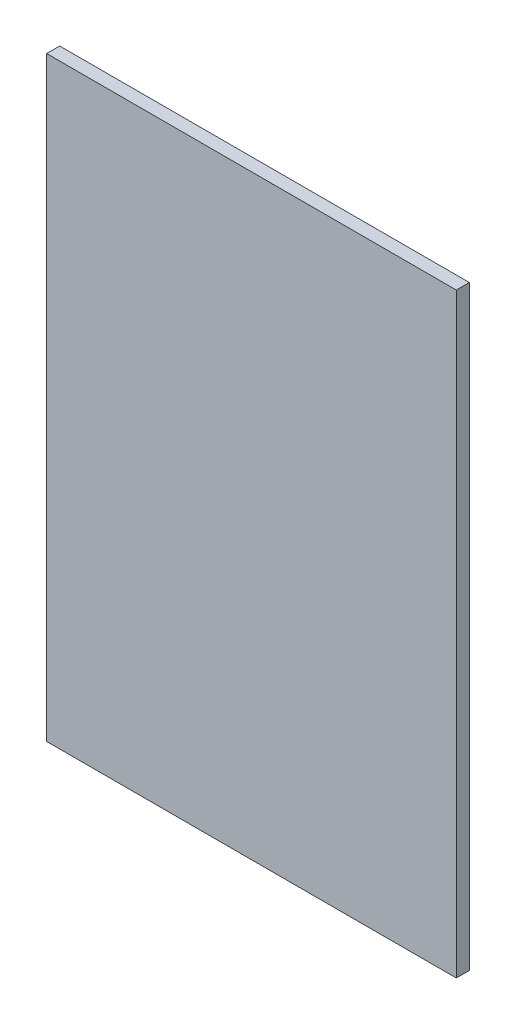
ISO-10303-21;
HEADER;
FILE_DESCRIPTION(('STEP AP214'),'2;1');
FILE_NAME('part.step','',(''),(''),'','','');
FILE_SCHEMA(('AUTOMOTIVE_DESIGN { 1 0 10303 214 1 1 1 1 }'));
ENDSEC;
DATA;
#1=APPLICATION_CONTEXT('core data for automotive mechanical design processes');
#2=APPLICATION_PROTOCOL_DEFINITION('international standard','automotive_design',2000,#1);
#3=PRODUCT_CONTEXT('',#1,'mechanical');
#4=PRODUCT('Part','Part','',(#3));
#5=PRODUCT_RELATED_PRODUCT_CATEGORY('part','',(#4));
#6=PRODUCT_DEFINITION_FORMATION('','',#4);
#7=PRODUCT_DEFINITION_CONTEXT('part definition',#1,'design');
#8=PRODUCT_DEFINITION('design','',#6,#7);
#9=PRODUCT_DEFINITION_SHAPE('','',#8);
#10=(LENGTH_UNIT() NAMED_UNIT(*) SI_UNIT(.MILLI.,.METRE.));
#11=(NAMED_UNIT(*) PLANE_ANGLE_UNIT() SI_UNIT($,.RADIAN.));
#12=(NAMED_UNIT(*) SI_UNIT($,.STERADIAN.) SOLID_ANGLE_UNIT());
#13=UNCERTAINTY_MEASURE_WITH_UNIT(LENGTH_MEASURE(1.E-05),#10,'distance_accuracy_value','');
#14=(GEOMETRIC_REPRESENTATION_CONTEXT(3) GLOBAL_UNCERTAINTY_ASSIGNED_CONTEXT((#13)) GLOBAL_UNIT_ASSIGNED_CONTEXT((#10,
#11,#12)) REPRESENTATION_CONTEXT('',''));
#15=CARTESIAN_POINT('',(0.,0.,0.));
#16=DIRECTION('',(0.,0.,1.));
#17=DIRECTION('',(1.,0.,0.));
#18=AXIS2_PLACEMENT_3D('',#15,#16,#17);
#19=CARTESIAN_POINT('',(0.,0.,17.78));
#20=DIRECTION('',(1.,0.,0.));
#21=DIRECTION('',(0.,0.,-1.));
#22=AXIS2_PLACEMENT_3D('',#19,#20,#21);
#23=PLANE('',#22);
#24=DIRECTION('',(0.,-1.,0.));
#25=VECTOR('',#24,1.);
#26=CARTESIAN_POINT('',(0.,0.,0.));
#27=LINE('',#26,#25);
#28=CARTESIAN_POINT('',(0.,812.8,0.));
#29=VERTEX_POINT('',#28);
#30=CARTESIAN_POINT('',(0.,0.,0.));
#31=VERTEX_POINT('',#30);
#32=EDGE_CURVE('E97',#29,#31,#27,.T.);
#33=ORIENTED_EDGE('',*,*,#32,.T.);
#34=DIRECTION('',(0.,0.,-1.));
#35=VECTOR('',#34,1.);
#36=CARTESIAN_POINT('',(0.,0.,17.78));
#37=LINE('',#36,#35);
#38=CARTESIAN_POINT('',(0.,0.,17.78));
#39=VERTEX_POINT('',#38);
#40=EDGE_CURVE('E11',#39,#31,#37,.T.);
#41=ORIENTED_EDGE('',*,*,#40,.F.);
#42=DIRECTION('',(0.,-1.,0.));
#43=VECTOR('',#42,1.);
#44=CARTESIAN_POINT('',(0.,0.,17.78));
#45=LINE('',#44,#43);
#46=CARTESIAN_POINT('',(0.,812.8,17.78));
#47=VERTEX_POINT('',#46);
#48=EDGE_CURVE('E85',#47,#39,#45,.T.);
#49=ORIENTED_EDGE('',*,*,#48,.F.);
#50=DIRECTION('',(0.,0.,-1.));
#51=VECTOR('',#50,1.);
#52=CARTESIAN_POINT('',(0.,812.8,17.78));
#53=LINE('',#52,#51);
#54=EDGE_CURVE('E93',#47,#29,#53,.T.);
#55=ORIENTED_EDGE('',*,*,#54,.T.);
#56=EDGE_LOOP('',(#33,#41,#49,#55));
#57=FACE_BOUND('',#56,.T.);
#58=ADVANCED_FACE('F34',(#57),#23,.F.);
#59=CARTESIAN_POINT('',(0.,0.,17.78));
#60=DIRECTION('',(0.,1.,0.));
#61=DIRECTION('',(0.,0.,1.));
#62=AXIS2_PLACEMENT_3D('',#59,#60,#61);
#63=PLANE('',#62);
#64=DIRECTION('',(1.,0.,0.));
#65=VECTOR('',#64,1.);
#66=CARTESIAN_POINT('',(0.,0.,0.));
#67=LINE('',#66,#65);
#68=CARTESIAN_POINT('',(558.8,0.,0.));
#69=VERTEX_POINT('',#68);
#70=EDGE_CURVE('E89',#31,#69,#67,.T.);
#71=ORIENTED_EDGE('',*,*,#70,.T.);
#72=DIRECTION('',(0.,0.,-1.));
#73=VECTOR('',#72,1.);
#74=CARTESIAN_POINT('',(558.8,0.,17.78));
#75=LINE('',#74,#73);
#76=CARTESIAN_POINT('',(558.8,0.,17.78));
#77=VERTEX_POINT('',#76);
#78=EDGE_CURVE('E42',#77,#69,#75,.T.);
#79=ORIENTED_EDGE('',*,*,#78,.F.);
#80=DIRECTION('',(1.,0.,0.));
#81=VECTOR('',#80,1.);
#82=CARTESIAN_POINT('',(0.,0.,17.78));
#83=LINE('',#82,#81);
#84=EDGE_CURVE('E80',#39,#77,#83,.T.);
#85=ORIENTED_EDGE('',*,*,#84,.F.);
#86=ORIENTED_EDGE('',*,*,#40,.T.);
#87=EDGE_LOOP('',(#71,#79,#85,#86));
#88=FACE_BOUND('',#87,.T.);
#89=ADVANCED_FACE('F88',(#88),#63,.F.);
#90=CARTESIAN_POINT('',(558.8,0.,17.78));
#91=DIRECTION('',(-1.,0.,0.));
#92=DIRECTION('',(0.,0.,1.));
#93=AXIS2_PLACEMENT_3D('',#90,#91,#92);
#94=PLANE('',#93);
#95=DIRECTION('',(0.,1.,0.));
#96=VECTOR('',#95,1.);
#97=CARTESIAN_POINT('',(558.8,0.,0.));
#98=LINE('',#97,#96);
#99=CARTESIAN_POINT('',(558.8,812.8,0.));
#100=VERTEX_POINT('',#99);
#101=EDGE_CURVE('E67',#69,#100,#98,.T.);
#102=ORIENTED_EDGE('',*,*,#101,.T.);
#103=DIRECTION('',(0.,0.,-1.));
#104=VECTOR('',#103,1.);
#105=CARTESIAN_POINT('',(558.8,812.8,17.78));
#106=LINE('',#105,#104);
#107=CARTESIAN_POINT('',(558.8,812.8,17.78));
#108=VERTEX_POINT('',#107);
#109=EDGE_CURVE('E90',#108,#100,#106,.T.);
#110=ORIENTED_EDGE('',*,*,#109,.F.);
#111=DIRECTION('',(0.,1.,0.));
#112=VECTOR('',#111,1.);
#113=CARTESIAN_POINT('',(558.8,0.,17.78));
#114=LINE('',#113,#112);
#115=EDGE_CURVE('E83',#77,#108,#114,.T.);
#116=ORIENTED_EDGE('',*,*,#115,.F.);
#117=ORIENTED_EDGE('',*,*,#78,.T.);
#118=EDGE_LOOP('',(#102,#110,#116,#117));
#119=FACE_BOUND('',#118,.T.);
#120=ADVANCED_FACE('F91',(#119),#94,.F.);
#121=CARTESIAN_POINT('',(0.,812.8,17.78));
#122=DIRECTION('',(0.,-1.,0.));
#123=DIRECTION('',(0.,0.,-1.));
#124=AXIS2_PLACEMENT_3D('',#121,#122,#123);
#125=PLANE('',#124);
#126=DIRECTION('',(-1.,0.,0.));
#127=VECTOR('',#126,1.);
#128=CARTESIAN_POINT('',(0.,812.8,0.));
#129=LINE('',#128,#127);
#130=EDGE_CURVE('E73',#100,#29,#129,.T.);
#131=ORIENTED_EDGE('',*,*,#130,.T.);
#132=ORIENTED_EDGE('',*,*,#54,.F.);
#133=DIRECTION('',(-1.,0.,0.));
#134=VECTOR('',#133,1.);
#135=CARTESIAN_POINT('',(0.,812.8,17.78));
#136=LINE('',#135,#134);
#137=EDGE_CURVE('E50',#108,#47,#136,.T.);
#138=ORIENTED_EDGE('',*,*,#137,.F.);
#139=ORIENTED_EDGE('',*,*,#109,.T.);
#140=EDGE_LOOP('',(#131,#132,#138,#139));
#141=FACE_BOUND('',#140,.T.);
#142=ADVANCED_FACE('F104',(#141),#125,.F.);
#143=CARTESIAN_POINT('',(0.,0.,17.78));
#144=DIRECTION('',(0.,0.,-1.));
#145=DIRECTION('',(-1.,0.,0.));
#146=AXIS2_PLACEMENT_3D('',#143,#144,#145);
#147=PLANE('',#146);
#148=ORIENTED_EDGE('',*,*,#48,.T.);
#149=ORIENTED_EDGE('',*,*,#84,.T.);
#150=ORIENTED_EDGE('',*,*,#115,.T.);
#151=ORIENTED_EDGE('',*,*,#137,.T.);
#152=EDGE_LOOP('',(#148,#149,#150,#151));
#153=FACE_BOUND('',#152,.T.);
#154=ADVANCED_FACE('F81',(#153),#147,.F.);
#155=CARTESIAN_POINT('',(0.,0.,0.));
#156=DIRECTION('',(0.,0.,-1.));
#157=DIRECTION('',(-1.,0.,0.));
#158=AXIS2_PLACEMENT_3D('',#155,#156,#157);
#159=PLANE('',#158);
#160=ORIENTED_EDGE('',*,*,#32,.F.);
#161=ORIENTED_EDGE('',*,*,#130,.F.);
#162=ORIENTED_EDGE('',*,*,#101,.F.);
#163=ORIENTED_EDGE('',*,*,#70,.F.);
#164=EDGE_LOOP('',(#160,#161,#162,#163));
#165=FACE_BOUND('',#164,.T.);
#166=ADVANCED_FACE('F107',(#165),#159,.T.);
#167=CLOSED_SHELL('',(#58,#89,#120,#142,#154,#166));
#168=MANIFOLD_SOLID_BREP('B2',#167);
#169=ADVANCED_BREP_SHAPE_REPRESENTATION('',(#18,#168),#14);
#170=SHAPE_DEFINITION_REPRESENTATION(#9,#169);
ENDSEC;
END-ISO-10303-21;
